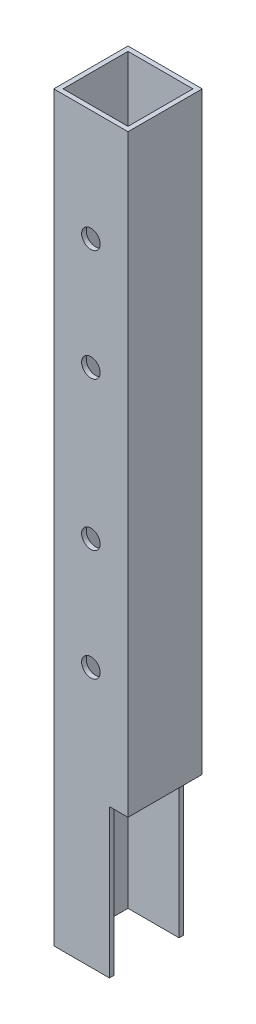
ISO-10303-21;
HEADER;
FILE_DESCRIPTION(('STEP AP214'),'2;1');
FILE_NAME('part.step','',(''),(''),'','','');
FILE_SCHEMA(('AUTOMOTIVE_DESIGN { 1 0 10303 214 1 1 1 1 }'));
ENDSEC;
DATA;
#1=APPLICATION_CONTEXT('core data for automotive mechanical design processes');
#2=APPLICATION_PROTOCOL_DEFINITION('international standard','automotive_design',2000,#1);
#3=PRODUCT_CONTEXT('',#1,'mechanical');
#4=PRODUCT('Part','Part','',(#3));
#5=PRODUCT_RELATED_PRODUCT_CATEGORY('part','',(#4));
#6=PRODUCT_DEFINITION_FORMATION('','',#4);
#7=PRODUCT_DEFINITION_CONTEXT('part definition',#1,'design');
#8=PRODUCT_DEFINITION('design','',#6,#7);
#9=PRODUCT_DEFINITION_SHAPE('','',#8);
#10=(LENGTH_UNIT() NAMED_UNIT(*) SI_UNIT(.MILLI.,.METRE.));
#11=(NAMED_UNIT(*) PLANE_ANGLE_UNIT() SI_UNIT($,.RADIAN.));
#12=(NAMED_UNIT(*) SI_UNIT($,.STERADIAN.) SOLID_ANGLE_UNIT());
#13=UNCERTAINTY_MEASURE_WITH_UNIT(LENGTH_MEASURE(1.E-05),#10,'distance_accuracy_value','');
#14=(GEOMETRIC_REPRESENTATION_CONTEXT(3) GLOBAL_UNCERTAINTY_ASSIGNED_CONTEXT((#13)) GLOBAL_UNIT_ASSIGNED_CONTEXT((#10,
#11,#12)) REPRESENTATION_CONTEXT('',''));
#15=CARTESIAN_POINT('',(0.,0.,0.));
#16=DIRECTION('',(0.,0.,1.));
#17=DIRECTION('',(1.,0.,0.));
#18=AXIS2_PLACEMENT_3D('',#15,#16,#17);
#19=CARTESIAN_POINT('',(0.,-101.6,0.));
#20=DIRECTION('',(0.,1.,0.));
#21=DIRECTION('',(0.,0.,1.));
#22=AXIS2_PLACEMENT_3D('',#19,#20,#21);
#23=PLANE('',#22);
#24=DIRECTION('',(0.,0.,1.));
#25=VECTOR('',#24,1.);
#26=CARTESIAN_POINT('',(6.35,-101.6,-12.7));
#27=LINE('',#26,#25);
#28=CARTESIAN_POINT('',(6.35,-101.6,-12.7));
#29=VERTEX_POINT('',#28);
#30=CARTESIAN_POINT('',(6.35,-101.6,-11.1125));
#31=VERTEX_POINT('',#30);
#32=EDGE_CURVE('E153',#29,#31,#27,.T.);
#33=ORIENTED_EDGE('',*,*,#32,.F.);
#34=DIRECTION('',(-1.,0.,0.));
#35=VECTOR('',#34,1.);
#36=CARTESIAN_POINT('',(-12.7,-101.6,-12.7));
#37=LINE('',#36,#35);
#38=CARTESIAN_POINT('',(12.7,-101.6,-12.7));
#39=VERTEX_POINT('',#38);
#40=EDGE_CURVE('E251',#39,#29,#37,.T.);
#41=ORIENTED_EDGE('',*,*,#40,.F.);
#42=DIRECTION('',(0.,0.,-1.));
#43=VECTOR('',#42,1.);
#44=CARTESIAN_POINT('',(12.7,-101.6,-12.7));
#45=LINE('',#44,#43);
#46=CARTESIAN_POINT('',(12.7,-101.6,12.7));
#47=VERTEX_POINT('',#46);
#48=EDGE_CURVE('E237',#47,#39,#45,.T.);
#49=ORIENTED_EDGE('',*,*,#48,.F.);
#50=DIRECTION('',(1.,0.,0.));
#51=VECTOR('',#50,1.);
#52=CARTESIAN_POINT('',(-12.7,-101.6,12.7));
#53=LINE('',#52,#51);
#54=CARTESIAN_POINT('',(6.35,-101.6,12.7));
#55=VERTEX_POINT('',#54);
#56=EDGE_CURVE('E242',#55,#47,#53,.T.);
#57=ORIENTED_EDGE('',*,*,#56,.F.);
#58=DIRECTION('',(0.,0.,1.));
#59=VECTOR('',#58,1.);
#60=CARTESIAN_POINT('',(6.35,-101.6,11.1125));
#61=LINE('',#60,#59);
#62=CARTESIAN_POINT('',(6.35,-101.6,11.1125));
#63=VERTEX_POINT('',#62);
#64=EDGE_CURVE('E54',#63,#55,#61,.T.);
#65=ORIENTED_EDGE('',*,*,#64,.F.);
#66=DIRECTION('',(1.,0.,0.));
#67=VECTOR('',#66,1.);
#68=CARTESIAN_POINT('',(-11.1125,-101.6,11.1125));
#69=LINE('',#68,#67);
#70=CARTESIAN_POINT('',(11.1125,-101.6,11.1125));
#71=VERTEX_POINT('',#70);
#72=EDGE_CURVE('E223',#63,#71,#69,.T.);
#73=ORIENTED_EDGE('',*,*,#72,.T.);
#74=DIRECTION('',(0.,0.,-1.));
#75=VECTOR('',#74,1.);
#76=CARTESIAN_POINT('',(11.1125,-101.6,-11.1125));
#77=LINE('',#76,#75);
#78=CARTESIAN_POINT('',(11.1125,-101.6,-11.1125));
#79=VERTEX_POINT('',#78);
#80=EDGE_CURVE('E219',#71,#79,#77,.T.);
#81=ORIENTED_EDGE('',*,*,#80,.T.);
#82=DIRECTION('',(-1.,0.,0.));
#83=VECTOR('',#82,1.);
#84=CARTESIAN_POINT('',(-11.1125,-101.6,-11.1125));
#85=LINE('',#84,#83);
#86=EDGE_CURVE('E61',#79,#31,#85,.T.);
#87=ORIENTED_EDGE('',*,*,#86,.T.);
#88=EDGE_LOOP('',(#33,#41,#49,#57,#65,#73,#81,#87));
#89=FACE_BOUND('',#88,.T.);
#90=ADVANCED_FACE('F37',(#89),#23,.F.);
#91=CARTESIAN_POINT('',(0.,101.6,0.));
#92=DIRECTION('',(0.,1.,0.));
#93=DIRECTION('',(0.,0.,1.));
#94=AXIS2_PLACEMENT_3D('',#91,#92,#93);
#95=PLANE('',#94);
#96=DIRECTION('',(0.,0.,-1.));
#97=VECTOR('',#96,1.);
#98=CARTESIAN_POINT('',(12.7,101.6,-12.7));
#99=LINE('',#98,#97);
#100=CARTESIAN_POINT('',(12.7,101.6,12.7));
#101=VERTEX_POINT('',#100);
#102=CARTESIAN_POINT('',(12.7,101.6,-12.7));
#103=VERTEX_POINT('',#102);
#104=EDGE_CURVE('E238',#101,#103,#99,.T.);
#105=ORIENTED_EDGE('',*,*,#104,.T.);
#106=DIRECTION('',(-1.,0.,0.));
#107=VECTOR('',#106,1.);
#108=CARTESIAN_POINT('',(-12.7,101.6,-12.7));
#109=LINE('',#108,#107);
#110=CARTESIAN_POINT('',(-12.7,101.6,-12.7));
#111=VERTEX_POINT('',#110);
#112=EDGE_CURVE('E241',#103,#111,#109,.T.);
#113=ORIENTED_EDGE('',*,*,#112,.T.);
#114=DIRECTION('',(0.,0.,1.));
#115=VECTOR('',#114,1.);
#116=CARTESIAN_POINT('',(-12.7,101.6,-12.7));
#117=LINE('',#116,#115);
#118=CARTESIAN_POINT('',(-12.7,101.6,12.7));
#119=VERTEX_POINT('',#118);
#120=EDGE_CURVE('E244',#111,#119,#117,.T.);
#121=ORIENTED_EDGE('',*,*,#120,.T.);
#122=DIRECTION('',(1.,0.,0.));
#123=VECTOR('',#122,1.);
#124=CARTESIAN_POINT('',(-12.7,101.6,12.7));
#125=LINE('',#124,#123);
#126=EDGE_CURVE('E246',#119,#101,#125,.T.);
#127=ORIENTED_EDGE('',*,*,#126,.T.);
#128=EDGE_LOOP('',(#105,#113,#121,#127));
#129=FACE_BOUND('',#128,.T.);
#130=DIRECTION('',(-1.,0.,0.));
#131=VECTOR('',#130,1.);
#132=CARTESIAN_POINT('',(-11.1125,101.6,-11.1125));
#133=LINE('',#132,#131);
#134=CARTESIAN_POINT('',(11.1125,101.6,-11.1125));
#135=VERTEX_POINT('',#134);
#136=CARTESIAN_POINT('',(-11.1125,101.6,-11.1125));
#137=VERTEX_POINT('',#136);
#138=EDGE_CURVE('E222',#135,#137,#133,.T.);
#139=ORIENTED_EDGE('',*,*,#138,.F.);
#140=DIRECTION('',(0.,0.,-1.));
#141=VECTOR('',#140,1.);
#142=CARTESIAN_POINT('',(11.1125,101.6,-11.1125));
#143=LINE('',#142,#141);
#144=CARTESIAN_POINT('',(11.1125,101.6,11.1125));
#145=VERTEX_POINT('',#144);
#146=EDGE_CURVE('E220',#145,#135,#143,.T.);
#147=ORIENTED_EDGE('',*,*,#146,.F.);
#148=DIRECTION('',(1.,0.,0.));
#149=VECTOR('',#148,1.);
#150=CARTESIAN_POINT('',(-11.1125,101.6,11.1125));
#151=LINE('',#150,#149);
#152=CARTESIAN_POINT('',(-11.1125,101.6,11.1125));
#153=VERTEX_POINT('',#152);
#154=EDGE_CURVE('E226',#153,#145,#151,.T.);
#155=ORIENTED_EDGE('',*,*,#154,.F.);
#156=DIRECTION('',(0.,0.,1.));
#157=VECTOR('',#156,1.);
#158=CARTESIAN_POINT('',(-11.1125,101.6,-11.1125));
#159=LINE('',#158,#157);
#160=EDGE_CURVE('E134',#137,#153,#159,.T.);
#161=ORIENTED_EDGE('',*,*,#160,.F.);
#162=EDGE_LOOP('',(#139,#147,#155,#161));
#163=FACE_BOUND('',#162,.T.);
#164=ADVANCED_FACE('F313',(#129,#163),#95,.T.);
#165=CARTESIAN_POINT('',(12.7,101.6,-12.7));
#166=DIRECTION('',(-1.,0.,0.));
#167=DIRECTION('',(0.,0.,1.));
#168=AXIS2_PLACEMENT_3D('',#165,#166,#167);
#169=PLANE('',#168);
#170=ORIENTED_EDGE('',*,*,#48,.T.);
#171=DIRECTION('',(0.,-1.,0.));
#172=VECTOR('',#171,1.);
#173=CARTESIAN_POINT('',(12.7,101.6,-12.7));
#174=LINE('',#173,#172);
#175=EDGE_CURVE('E11',#103,#39,#174,.T.);
#176=ORIENTED_EDGE('',*,*,#175,.F.);
#177=ORIENTED_EDGE('',*,*,#104,.F.);
#178=DIRECTION('',(0.,-1.,0.));
#179=VECTOR('',#178,1.);
#180=CARTESIAN_POINT('',(12.7,101.6,12.7));
#181=LINE('',#180,#179);
#182=EDGE_CURVE('E248',#101,#47,#181,.T.);
#183=ORIENTED_EDGE('',*,*,#182,.T.);
#184=EDGE_LOOP('',(#170,#176,#177,#183));
#185=FACE_BOUND('',#184,.T.);
#186=ADVANCED_FACE('F39',(#185),#169,.F.);
#187=CARTESIAN_POINT('',(-12.7,101.6,-12.7));
#188=DIRECTION('',(0.,0.,1.));
#189=DIRECTION('',(1.,0.,0.));
#190=AXIS2_PLACEMENT_3D('',#187,#188,#189);
#191=PLANE('',#190);
#192=CARTESIAN_POINT('',(0.,-25.4,-12.7));
#193=DIRECTION('',(0.,0.,1.));
#194=DIRECTION('',(1.,0.,0.));
#195=AXIS2_PLACEMENT_3D('',#192,#193,#194);
#196=CIRCLE('',#195,3.175);
#197=CARTESIAN_POINT('',(3.175,-25.4,-12.7));
#198=VERTEX_POINT('',#197);
#199=EDGE_CURVE('E181',#198,#198,#196,.T.);
#200=ORIENTED_EDGE('',*,*,#199,.T.);
#201=EDGE_LOOP('',(#200));
#202=FACE_BOUND('',#201,.T.);
#203=CARTESIAN_POINT('',(0.,25.4,-12.7));
#204=DIRECTION('',(0.,0.,1.));
#205=DIRECTION('',(1.,0.,0.));
#206=AXIS2_PLACEMENT_3D('',#203,#204,#205);
#207=CIRCLE('',#206,3.175);
#208=CARTESIAN_POINT('',(3.175,25.4,-12.7));
#209=VERTEX_POINT('',#208);
#210=EDGE_CURVE('E190',#209,#209,#207,.T.);
#211=ORIENTED_EDGE('',*,*,#210,.T.);
#212=EDGE_LOOP('',(#211));
#213=FACE_BOUND('',#212,.T.);
#214=CARTESIAN_POINT('',(0.,-63.5,-12.7));
#215=DIRECTION('',(0.,0.,1.));
#216=DIRECTION('',(1.,0.,0.));
#217=AXIS2_PLACEMENT_3D('',#214,#215,#216);
#218=CIRCLE('',#217,3.175);
#219=CARTESIAN_POINT('',(3.175,-63.5,-12.7));
#220=VERTEX_POINT('',#219);
#221=EDGE_CURVE('E200',#220,#220,#218,.T.);
#222=ORIENTED_EDGE('',*,*,#221,.T.);
#223=EDGE_LOOP('',(#222));
#224=FACE_BOUND('',#223,.T.);
#225=CARTESIAN_POINT('',(0.,63.5,-12.7));
#226=DIRECTION('',(0.,0.,1.));
#227=DIRECTION('',(1.,0.,0.));
#228=AXIS2_PLACEMENT_3D('',#225,#226,#227);
#229=CIRCLE('',#228,3.175);
#230=CARTESIAN_POINT('',(3.175,63.5,-12.7));
#231=VERTEX_POINT('',#230);
#232=EDGE_CURVE('E210',#231,#231,#229,.T.);
#233=ORIENTED_EDGE('',*,*,#232,.T.);
#234=EDGE_LOOP('',(#233));
#235=FACE_BOUND('',#234,.T.);
#236=ORIENTED_EDGE('',*,*,#40,.T.);
#237=DIRECTION('',(0.,1.,0.));
#238=VECTOR('',#237,1.);
#239=CARTESIAN_POINT('',(6.35,-152.4,-12.7));
#240=LINE('',#239,#238);
#241=CARTESIAN_POINT('',(6.35,-152.4,-12.7));
#242=VERTEX_POINT('',#241);
#243=EDGE_CURVE('E173',#242,#29,#240,.T.);
#244=ORIENTED_EDGE('',*,*,#243,.F.);
#245=DIRECTION('',(1.,0.,0.));
#246=VECTOR('',#245,1.);
#247=CARTESIAN_POINT('',(6.35,-152.4,-12.7));
#248=LINE('',#247,#246);
#249=CARTESIAN_POINT('',(-12.7,-152.4,-12.7));
#250=VERTEX_POINT('',#249);
#251=EDGE_CURVE('E164',#250,#242,#248,.T.);
#252=ORIENTED_EDGE('',*,*,#251,.F.);
#253=DIRECTION('',(0.,-1.,0.));
#254=VECTOR('',#253,1.);
#255=CARTESIAN_POINT('',(-12.7,101.6,-12.7));
#256=LINE('',#255,#254);
#257=EDGE_CURVE('E46',#111,#250,#256,.T.);
#258=ORIENTED_EDGE('',*,*,#257,.F.);
#259=ORIENTED_EDGE('',*,*,#112,.F.);
#260=ORIENTED_EDGE('',*,*,#175,.T.);
#261=EDGE_LOOP('',(#236,#244,#252,#258,#259,#260));
#262=FACE_BOUND('',#261,.T.);
#263=ADVANCED_FACE('F302',(#202,#213,#224,#235,#262),#191,.F.);
#264=CARTESIAN_POINT('',(-12.7,101.6,-12.7));
#265=DIRECTION('',(1.,0.,0.));
#266=DIRECTION('',(0.,0.,-1.));
#267=AXIS2_PLACEMENT_3D('',#264,#265,#266);
#268=PLANE('',#267);
#269=ORIENTED_EDGE('',*,*,#257,.T.);
#270=DIRECTION('',(0.,0.,-1.));
#271=VECTOR('',#270,1.);
#272=CARTESIAN_POINT('',(-12.7,-152.4,-12.7));
#273=LINE('',#272,#271);
#274=CARTESIAN_POINT('',(-12.7,-152.4,12.7));
#275=VERTEX_POINT('',#274);
#276=EDGE_CURVE('E161',#275,#250,#273,.T.);
#277=ORIENTED_EDGE('',*,*,#276,.F.);
#278=DIRECTION('',(0.,-1.,0.));
#279=VECTOR('',#278,1.);
#280=CARTESIAN_POINT('',(-12.7,101.6,12.7));
#281=LINE('',#280,#279);
#282=EDGE_CURVE('E257',#119,#275,#281,.T.);
#283=ORIENTED_EDGE('',*,*,#282,.F.);
#284=ORIENTED_EDGE('',*,*,#120,.F.);
#285=EDGE_LOOP('',(#269,#277,#283,#284));
#286=FACE_BOUND('',#285,.T.);
#287=ADVANCED_FACE('F288',(#286),#268,.F.);
#288=CARTESIAN_POINT('',(-12.7,101.6,12.7));
#289=DIRECTION('',(0.,0.,-1.));
#290=DIRECTION('',(-1.,0.,0.));
#291=AXIS2_PLACEMENT_3D('',#288,#289,#290);
#292=PLANE('',#291);
#293=CARTESIAN_POINT('',(0.,-25.4,12.7));
#294=DIRECTION('',(0.,0.,1.));
#295=DIRECTION('',(1.,0.,0.));
#296=AXIS2_PLACEMENT_3D('',#293,#294,#295);
#297=CIRCLE('',#296,3.175);
#298=CARTESIAN_POINT('',(3.175,-25.4,12.7));
#299=VERTEX_POINT('',#298);
#300=EDGE_CURVE('E180',#299,#299,#297,.T.);
#301=ORIENTED_EDGE('',*,*,#300,.F.);
#302=EDGE_LOOP('',(#301));
#303=FACE_BOUND('',#302,.T.);
#304=CARTESIAN_POINT('',(0.,25.4,12.7));
#305=DIRECTION('',(0.,0.,1.));
#306=DIRECTION('',(1.,0.,0.));
#307=AXIS2_PLACEMENT_3D('',#304,#305,#306);
#308=CIRCLE('',#307,3.175);
#309=CARTESIAN_POINT('',(3.175,25.4,12.7));
#310=VERTEX_POINT('',#309);
#311=EDGE_CURVE('E189',#310,#310,#308,.T.);
#312=ORIENTED_EDGE('',*,*,#311,.F.);
#313=EDGE_LOOP('',(#312));
#314=FACE_BOUND('',#313,.T.);
#315=CARTESIAN_POINT('',(0.,-63.5,12.7));
#316=DIRECTION('',(0.,0.,1.));
#317=DIRECTION('',(1.,0.,0.));
#318=AXIS2_PLACEMENT_3D('',#315,#316,#317);
#319=CIRCLE('',#318,3.175);
#320=CARTESIAN_POINT('',(3.175,-63.5,12.7));
#321=VERTEX_POINT('',#320);
#322=EDGE_CURVE('E199',#321,#321,#319,.T.);
#323=ORIENTED_EDGE('',*,*,#322,.F.);
#324=EDGE_LOOP('',(#323));
#325=FACE_BOUND('',#324,.T.);
#326=CARTESIAN_POINT('',(0.,63.5,12.7));
#327=DIRECTION('',(0.,0.,1.));
#328=DIRECTION('',(1.,0.,0.));
#329=AXIS2_PLACEMENT_3D('',#326,#327,#328);
#330=CIRCLE('',#329,3.175);
#331=CARTESIAN_POINT('',(3.175,63.5,12.7));
#332=VERTEX_POINT('',#331);
#333=EDGE_CURVE('E209',#332,#332,#330,.T.);
#334=ORIENTED_EDGE('',*,*,#333,.F.);
#335=EDGE_LOOP('',(#334));
#336=FACE_BOUND('',#335,.T.);
#337=ORIENTED_EDGE('',*,*,#282,.T.);
#338=DIRECTION('',(-1.,0.,0.));
#339=VECTOR('',#338,1.);
#340=CARTESIAN_POINT('',(-12.7,-152.4,12.7));
#341=LINE('',#340,#339);
#342=CARTESIAN_POINT('',(6.35,-152.4,12.7));
#343=VERTEX_POINT('',#342);
#344=EDGE_CURVE('E158',#343,#275,#341,.T.);
#345=ORIENTED_EDGE('',*,*,#344,.F.);
#346=DIRECTION('',(0.,1.,0.));
#347=VECTOR('',#346,1.);
#348=CARTESIAN_POINT('',(6.35,-152.4,12.7));
#349=LINE('',#348,#347);
#350=EDGE_CURVE('E176',#343,#55,#349,.T.);
#351=ORIENTED_EDGE('',*,*,#350,.T.);
#352=ORIENTED_EDGE('',*,*,#56,.T.);
#353=ORIENTED_EDGE('',*,*,#182,.F.);
#354=ORIENTED_EDGE('',*,*,#126,.F.);
#355=EDGE_LOOP('',(#337,#345,#351,#352,#353,#354));
#356=FACE_BOUND('',#355,.T.);
#357=ADVANCED_FACE('F284',(#303,#314,#325,#336,#356),#292,.F.);
#358=CARTESIAN_POINT('',(11.1125,101.6,-11.1125));
#359=DIRECTION('',(-1.,0.,0.));
#360=DIRECTION('',(0.,0.,1.));
#361=AXIS2_PLACEMENT_3D('',#358,#359,#360);
#362=PLANE('',#361);
#363=ORIENTED_EDGE('',*,*,#80,.F.);
#364=DIRECTION('',(0.,-1.,0.));
#365=VECTOR('',#364,1.);
#366=CARTESIAN_POINT('',(11.1125,101.6,11.1125));
#367=LINE('',#366,#365);
#368=EDGE_CURVE('E138',#145,#71,#367,.T.);
#369=ORIENTED_EDGE('',*,*,#368,.F.);
#370=ORIENTED_EDGE('',*,*,#146,.T.);
#371=DIRECTION('',(0.,-1.,0.));
#372=VECTOR('',#371,1.);
#373=CARTESIAN_POINT('',(11.1125,101.6,-11.1125));
#374=LINE('',#373,#372);
#375=EDGE_CURVE('E234',#135,#79,#374,.T.);
#376=ORIENTED_EDGE('',*,*,#375,.T.);
#377=EDGE_LOOP('',(#363,#369,#370,#376));
#378=FACE_BOUND('',#377,.T.);
#379=ADVANCED_FACE('F287',(#378),#362,.T.);
#380=CARTESIAN_POINT('',(-11.1125,101.6,-11.1125));
#381=DIRECTION('',(0.,0.,1.));
#382=DIRECTION('',(1.,0.,0.));
#383=AXIS2_PLACEMENT_3D('',#380,#381,#382);
#384=PLANE('',#383);
#385=CARTESIAN_POINT('',(0.,-25.4,-11.1125));
#386=DIRECTION('',(0.,0.,1.));
#387=DIRECTION('',(1.,0.,0.));
#388=AXIS2_PLACEMENT_3D('',#385,#386,#387);
#389=CIRCLE('',#388,3.175);
#390=CARTESIAN_POINT('',(3.175,-25.4,-11.1125));
#391=VERTEX_POINT('',#390);
#392=EDGE_CURVE('E186',#391,#391,#389,.T.);
#393=ORIENTED_EDGE('',*,*,#392,.F.);
#394=EDGE_LOOP('',(#393));
#395=FACE_BOUND('',#394,.T.);
#396=CARTESIAN_POINT('',(0.,25.4,-11.1125));
#397=DIRECTION('',(0.,0.,1.));
#398=DIRECTION('',(1.,0.,0.));
#399=AXIS2_PLACEMENT_3D('',#396,#397,#398);
#400=CIRCLE('',#399,3.175);
#401=CARTESIAN_POINT('',(3.175,25.4,-11.1125));
#402=VERTEX_POINT('',#401);
#403=EDGE_CURVE('E196',#402,#402,#400,.T.);
#404=ORIENTED_EDGE('',*,*,#403,.F.);
#405=EDGE_LOOP('',(#404));
#406=FACE_BOUND('',#405,.T.);
#407=CARTESIAN_POINT('',(0.,-63.5,-11.1125));
#408=DIRECTION('',(0.,0.,1.));
#409=DIRECTION('',(1.,0.,0.));
#410=AXIS2_PLACEMENT_3D('',#407,#408,#409);
#411=CIRCLE('',#410,3.175);
#412=CARTESIAN_POINT('',(3.175,-63.5,-11.1125));
#413=VERTEX_POINT('',#412);
#414=EDGE_CURVE('E206',#413,#413,#411,.T.);
#415=ORIENTED_EDGE('',*,*,#414,.F.);
#416=EDGE_LOOP('',(#415));
#417=FACE_BOUND('',#416,.T.);
#418=CARTESIAN_POINT('',(0.,63.5,-11.1125));
#419=DIRECTION('',(0.,0.,1.));
#420=DIRECTION('',(1.,0.,0.));
#421=AXIS2_PLACEMENT_3D('',#418,#419,#420);
#422=CIRCLE('',#421,3.175);
#423=CARTESIAN_POINT('',(3.175,63.5,-11.1125));
#424=VERTEX_POINT('',#423);
#425=EDGE_CURVE('E216',#424,#424,#422,.T.);
#426=ORIENTED_EDGE('',*,*,#425,.F.);
#427=EDGE_LOOP('',(#426));
#428=FACE_BOUND('',#427,.T.);
#429=ORIENTED_EDGE('',*,*,#86,.F.);
#430=ORIENTED_EDGE('',*,*,#375,.F.);
#431=ORIENTED_EDGE('',*,*,#138,.T.);
#432=DIRECTION('',(0.,-1.,0.));
#433=VECTOR('',#432,1.);
#434=CARTESIAN_POINT('',(-11.1125,101.6,-11.1125));
#435=LINE('',#434,#433);
#436=CARTESIAN_POINT('',(-11.1125,-152.4,-11.1125));
#437=VERTEX_POINT('',#436);
#438=EDGE_CURVE('E137',#137,#437,#435,.T.);
#439=ORIENTED_EDGE('',*,*,#438,.T.);
#440=DIRECTION('',(-1.,0.,0.));
#441=VECTOR('',#440,1.);
#442=CARTESIAN_POINT('',(6.35,-152.4,-11.1125));
#443=LINE('',#442,#441);
#444=CARTESIAN_POINT('',(6.35,-152.4,-11.1125));
#445=VERTEX_POINT('',#444);
#446=EDGE_CURVE('E152',#445,#437,#443,.T.);
#447=ORIENTED_EDGE('',*,*,#446,.F.);
#448=DIRECTION('',(0.,1.,0.));
#449=VECTOR('',#448,1.);
#450=CARTESIAN_POINT('',(6.35,-152.4,-11.1125));
#451=LINE('',#450,#449);
#452=EDGE_CURVE('E169',#445,#31,#451,.T.);
#453=ORIENTED_EDGE('',*,*,#452,.T.);
#454=EDGE_LOOP('',(#429,#430,#431,#439,#447,#453));
#455=FACE_BOUND('',#454,.T.);
#456=ADVANCED_FACE('F309',(#395,#406,#417,#428,#455),#384,.T.);
#457=CARTESIAN_POINT('',(-11.1125,101.6,-11.1125));
#458=DIRECTION('',(1.,0.,0.));
#459=DIRECTION('',(0.,0.,-1.));
#460=AXIS2_PLACEMENT_3D('',#457,#458,#459);
#461=PLANE('',#460);
#462=DIRECTION('',(0.,-1.,0.));
#463=VECTOR('',#462,1.);
#464=CARTESIAN_POINT('',(-11.1125,101.6,11.1125));
#465=LINE('',#464,#463);
#466=CARTESIAN_POINT('',(-11.1125,-152.4,11.1125));
#467=VERTEX_POINT('',#466);
#468=EDGE_CURVE('E127',#153,#467,#465,.T.);
#469=ORIENTED_EDGE('',*,*,#468,.T.);
#470=DIRECTION('',(0.,0.,1.));
#471=VECTOR('',#470,1.);
#472=CARTESIAN_POINT('',(-11.1125,-152.4,-11.1125));
#473=LINE('',#472,#471);
#474=EDGE_CURVE('E132',#437,#467,#473,.T.);
#475=ORIENTED_EDGE('',*,*,#474,.F.);
#476=ORIENTED_EDGE('',*,*,#438,.F.);
#477=ORIENTED_EDGE('',*,*,#160,.T.);
#478=EDGE_LOOP('',(#469,#475,#476,#477));
#479=FACE_BOUND('',#478,.T.);
#480=ADVANCED_FACE('F129',(#479),#461,.T.);
#481=CARTESIAN_POINT('',(-11.1125,101.6,11.1125));
#482=DIRECTION('',(0.,0.,-1.));
#483=DIRECTION('',(-1.,0.,0.));
#484=AXIS2_PLACEMENT_3D('',#481,#482,#483);
#485=PLANE('',#484);
#486=CARTESIAN_POINT('',(0.,-25.4,11.1125));
#487=DIRECTION('',(0.,0.,-1.));
#488=DIRECTION('',(-1.,0.,0.));
#489=AXIS2_PLACEMENT_3D('',#486,#487,#488);
#490=CIRCLE('',#489,3.175);
#491=CARTESIAN_POINT('',(-3.175,-25.4,11.1125));
#492=VERTEX_POINT('',#491);
#493=EDGE_CURVE('E41',#492,#492,#490,.T.);
#494=ORIENTED_EDGE('',*,*,#493,.F.);
#495=EDGE_LOOP('',(#494));
#496=FACE_BOUND('',#495,.T.);
#497=CARTESIAN_POINT('',(0.,25.4,11.1125));
#498=DIRECTION('',(0.,0.,-1.));
#499=DIRECTION('',(-1.,0.,0.));
#500=AXIS2_PLACEMENT_3D('',#497,#498,#499);
#501=CIRCLE('',#500,3.175);
#502=CARTESIAN_POINT('',(-3.175,25.4,11.1125));
#503=VERTEX_POINT('',#502);
#504=EDGE_CURVE('E193',#503,#503,#501,.T.);
#505=ORIENTED_EDGE('',*,*,#504,.F.);
#506=EDGE_LOOP('',(#505));
#507=FACE_BOUND('',#506,.T.);
#508=CARTESIAN_POINT('',(0.,-63.5,11.1125));
#509=DIRECTION('',(0.,0.,-1.));
#510=DIRECTION('',(-1.,0.,0.));
#511=AXIS2_PLACEMENT_3D('',#508,#509,#510);
#512=CIRCLE('',#511,3.175);
#513=CARTESIAN_POINT('',(-3.175,-63.5,11.1125));
#514=VERTEX_POINT('',#513);
#515=EDGE_CURVE('E203',#514,#514,#512,.T.);
#516=ORIENTED_EDGE('',*,*,#515,.F.);
#517=EDGE_LOOP('',(#516));
#518=FACE_BOUND('',#517,.T.);
#519=CARTESIAN_POINT('',(0.,63.5,11.1125));
#520=DIRECTION('',(0.,0.,-1.));
#521=DIRECTION('',(-1.,0.,0.));
#522=AXIS2_PLACEMENT_3D('',#519,#520,#521);
#523=CIRCLE('',#522,3.175);
#524=CARTESIAN_POINT('',(-3.175,63.5,11.1125));
#525=VERTEX_POINT('',#524);
#526=EDGE_CURVE('E213',#525,#525,#523,.T.);
#527=ORIENTED_EDGE('',*,*,#526,.F.);
#528=EDGE_LOOP('',(#527));
#529=FACE_BOUND('',#528,.T.);
#530=ORIENTED_EDGE('',*,*,#72,.F.);
#531=DIRECTION('',(0.,1.,0.));
#532=VECTOR('',#531,1.);
#533=CARTESIAN_POINT('',(6.35,-152.4,11.1125));
#534=LINE('',#533,#532);
#535=CARTESIAN_POINT('',(6.35,-152.4,11.1125));
#536=VERTEX_POINT('',#535);
#537=EDGE_CURVE('E144',#536,#63,#534,.T.);
#538=ORIENTED_EDGE('',*,*,#537,.F.);
#539=DIRECTION('',(1.,0.,0.));
#540=VECTOR('',#539,1.);
#541=CARTESIAN_POINT('',(-11.1125,-152.4,11.1125));
#542=LINE('',#541,#540);
#543=EDGE_CURVE('E141',#467,#536,#542,.T.);
#544=ORIENTED_EDGE('',*,*,#543,.F.);
#545=ORIENTED_EDGE('',*,*,#468,.F.);
#546=ORIENTED_EDGE('',*,*,#154,.T.);
#547=ORIENTED_EDGE('',*,*,#368,.T.);
#548=EDGE_LOOP('',(#530,#538,#544,#545,#546,#547));
#549=FACE_BOUND('',#548,.T.);
#550=ADVANCED_FACE('F142',(#496,#507,#518,#529,#549),#485,.T.);
#551=CARTESIAN_POINT('',(0.,63.5,-12.7));
#552=DIRECTION('',(0.,0.,1.));
#553=DIRECTION('',(1.,0.,0.));
#554=AXIS2_PLACEMENT_3D('',#551,#552,#553);
#555=CYLINDRICAL_SURFACE('',#554,3.175);
#556=ORIENTED_EDGE('',*,*,#526,.T.);
#557=EDGE_LOOP('',(#556));
#558=FACE_BOUND('',#557,.T.);
#559=ORIENTED_EDGE('',*,*,#333,.T.);
#560=EDGE_LOOP('',(#559));
#561=FACE_BOUND('',#560,.T.);
#562=ADVANCED_FACE('F271',(#558,#561),#555,.F.);
#563=ORIENTED_EDGE('',*,*,#425,.T.);
#564=EDGE_LOOP('',(#563));
#565=FACE_BOUND('',#564,.T.);
#566=ORIENTED_EDGE('',*,*,#232,.F.);
#567=EDGE_LOOP('',(#566));
#568=FACE_BOUND('',#567,.T.);
#569=ADVANCED_FACE('F280',(#565,#568),#555,.F.);
#570=CARTESIAN_POINT('',(0.,-63.5,-12.7));
#571=DIRECTION('',(0.,0.,1.));
#572=DIRECTION('',(1.,0.,0.));
#573=AXIS2_PLACEMENT_3D('',#570,#571,#572);
#574=CYLINDRICAL_SURFACE('',#573,3.175);
#575=ORIENTED_EDGE('',*,*,#515,.T.);
#576=EDGE_LOOP('',(#575));
#577=FACE_BOUND('',#576,.T.);
#578=ORIENTED_EDGE('',*,*,#322,.T.);
#579=EDGE_LOOP('',(#578));
#580=FACE_BOUND('',#579,.T.);
#581=ADVANCED_FACE('F349',(#577,#580),#574,.F.);
#582=ORIENTED_EDGE('',*,*,#414,.T.);
#583=EDGE_LOOP('',(#582));
#584=FACE_BOUND('',#583,.T.);
#585=ORIENTED_EDGE('',*,*,#221,.F.);
#586=EDGE_LOOP('',(#585));
#587=FACE_BOUND('',#586,.T.);
#588=ADVANCED_FACE('F354',(#584,#587),#574,.F.);
#589=CARTESIAN_POINT('',(0.,25.4,-12.7));
#590=DIRECTION('',(0.,0.,1.));
#591=DIRECTION('',(1.,0.,0.));
#592=AXIS2_PLACEMENT_3D('',#589,#590,#591);
#593=CYLINDRICAL_SURFACE('',#592,3.175);
#594=ORIENTED_EDGE('',*,*,#504,.T.);
#595=EDGE_LOOP('',(#594));
#596=FACE_BOUND('',#595,.T.);
#597=ORIENTED_EDGE('',*,*,#311,.T.);
#598=EDGE_LOOP('',(#597));
#599=FACE_BOUND('',#598,.T.);
#600=ADVANCED_FACE('F266',(#596,#599),#593,.F.);
#601=ORIENTED_EDGE('',*,*,#403,.T.);
#602=EDGE_LOOP('',(#601));
#603=FACE_BOUND('',#602,.T.);
#604=ORIENTED_EDGE('',*,*,#210,.F.);
#605=EDGE_LOOP('',(#604));
#606=FACE_BOUND('',#605,.T.);
#607=ADVANCED_FACE('F378',(#603,#606),#593,.F.);
#608=CARTESIAN_POINT('',(0.,-25.4,-12.7));
#609=DIRECTION('',(0.,0.,1.));
#610=DIRECTION('',(1.,0.,0.));
#611=AXIS2_PLACEMENT_3D('',#608,#609,#610);
#612=CYLINDRICAL_SURFACE('',#611,3.175);
#613=ORIENTED_EDGE('',*,*,#493,.T.);
#614=EDGE_LOOP('',(#613));
#615=FACE_BOUND('',#614,.T.);
#616=ORIENTED_EDGE('',*,*,#300,.T.);
#617=EDGE_LOOP('',(#616));
#618=FACE_BOUND('',#617,.T.);
#619=ADVANCED_FACE('F382',(#615,#618),#612,.F.);
#620=ORIENTED_EDGE('',*,*,#392,.T.);
#621=EDGE_LOOP('',(#620));
#622=FACE_BOUND('',#621,.T.);
#623=ORIENTED_EDGE('',*,*,#199,.F.);
#624=EDGE_LOOP('',(#623));
#625=FACE_BOUND('',#624,.T.);
#626=ADVANCED_FACE('F387',(#622,#625),#612,.F.);
#627=CARTESIAN_POINT('',(6.35,-152.4,11.1125));
#628=DIRECTION('',(-1.,0.,0.));
#629=DIRECTION('',(0.,0.,1.));
#630=AXIS2_PLACEMENT_3D('',#627,#628,#629);
#631=PLANE('',#630);
#632=ORIENTED_EDGE('',*,*,#64,.T.);
#633=ORIENTED_EDGE('',*,*,#350,.F.);
#634=DIRECTION('',(0.,0.,1.));
#635=VECTOR('',#634,1.);
#636=CARTESIAN_POINT('',(6.35,-152.4,11.1125));
#637=LINE('',#636,#635);
#638=EDGE_CURVE('E147',#536,#343,#637,.T.);
#639=ORIENTED_EDGE('',*,*,#638,.F.);
#640=ORIENTED_EDGE('',*,*,#537,.T.);
#641=EDGE_LOOP('',(#632,#633,#639,#640));
#642=FACE_BOUND('',#641,.T.);
#643=ADVANCED_FACE('F319',(#642),#631,.F.);
#644=CARTESIAN_POINT('',(6.35,-152.4,-12.7));
#645=DIRECTION('',(-1.,0.,0.));
#646=DIRECTION('',(0.,0.,1.));
#647=AXIS2_PLACEMENT_3D('',#644,#645,#646);
#648=PLANE('',#647);
#649=ORIENTED_EDGE('',*,*,#32,.T.);
#650=ORIENTED_EDGE('',*,*,#452,.F.);
#651=DIRECTION('',(0.,0.,1.));
#652=VECTOR('',#651,1.);
#653=CARTESIAN_POINT('',(6.35,-152.4,-12.7));
#654=LINE('',#653,#652);
#655=EDGE_CURVE('E166',#242,#445,#654,.T.);
#656=ORIENTED_EDGE('',*,*,#655,.F.);
#657=ORIENTED_EDGE('',*,*,#243,.T.);
#658=EDGE_LOOP('',(#649,#650,#656,#657));
#659=FACE_BOUND('',#658,.T.);
#660=ADVANCED_FACE('F307',(#659),#648,.F.);
#661=CARTESIAN_POINT('',(0.,-152.4,0.));
#662=DIRECTION('',(0.,1.,0.));
#663=DIRECTION('',(0.,0.,1.));
#664=AXIS2_PLACEMENT_3D('',#661,#662,#663);
#665=PLANE('',#664);
#666=ORIENTED_EDGE('',*,*,#474,.T.);
#667=ORIENTED_EDGE('',*,*,#543,.T.);
#668=ORIENTED_EDGE('',*,*,#638,.T.);
#669=ORIENTED_EDGE('',*,*,#344,.T.);
#670=ORIENTED_EDGE('',*,*,#276,.T.);
#671=ORIENTED_EDGE('',*,*,#251,.T.);
#672=ORIENTED_EDGE('',*,*,#655,.T.);
#673=ORIENTED_EDGE('',*,*,#446,.T.);
#674=EDGE_LOOP('',(#666,#667,#668,#669,#670,#671,#672,#673));
#675=FACE_BOUND('',#674,.T.);
#676=ADVANCED_FACE('F150',(#675),#665,.F.);
#677=CLOSED_SHELL('',(#90,#164,#186,#263,#287,#357,#379,#456,#480,#550,#562,#569,#581,#588,#600,
#607,#619,#626,#643,#660,#676));
#678=MANIFOLD_SOLID_BREP('B2',#677);
#679=ADVANCED_BREP_SHAPE_REPRESENTATION('',(#18,#678),#14);
#680=SHAPE_DEFINITION_REPRESENTATION(#9,#679);
ENDSEC;
END-ISO-10303-21;
